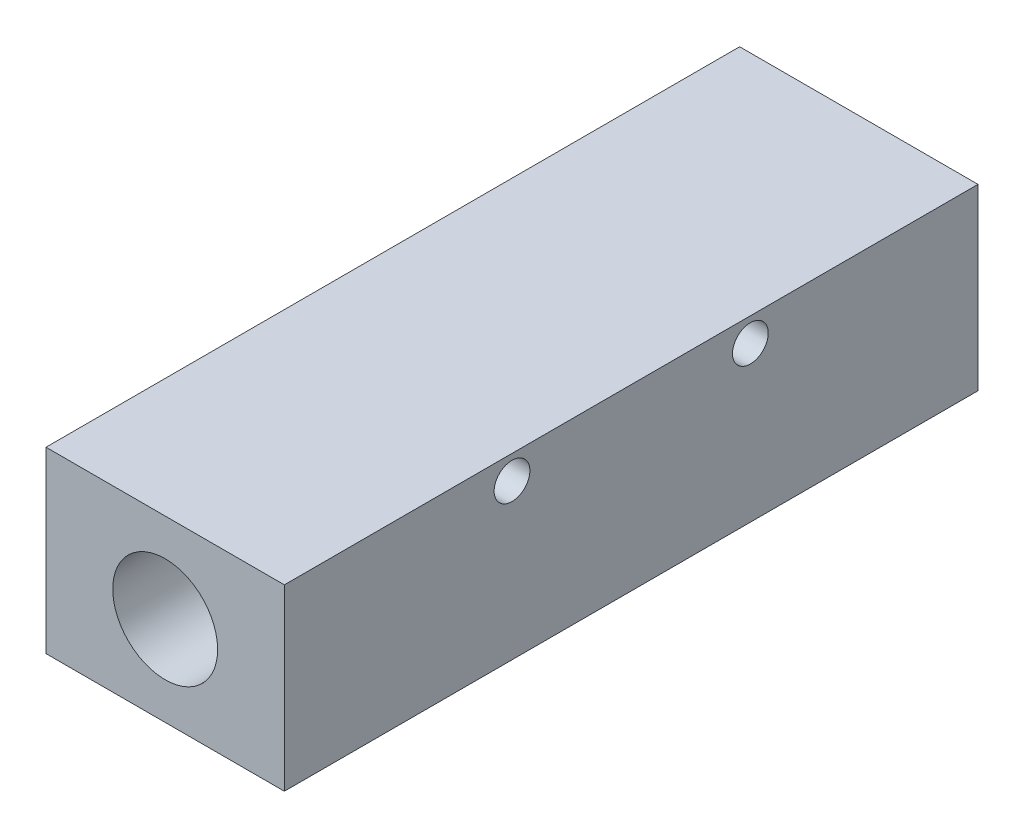
ISO-10303-21;
HEADER;
FILE_DESCRIPTION(('STEP AP214'),'2;1');
FILE_NAME('part.step','',(''),(''),'','','');
FILE_SCHEMA(('AUTOMOTIVE_DESIGN { 1 0 10303 214 1 1 1 1 }'));
ENDSEC;
DATA;
#1=APPLICATION_CONTEXT('core data for automotive mechanical design processes');
#2=APPLICATION_PROTOCOL_DEFINITION('international standard','automotive_design',2000,#1);
#3=PRODUCT_CONTEXT('',#1,'mechanical');
#4=PRODUCT('Part','Part','',(#3));
#5=PRODUCT_RELATED_PRODUCT_CATEGORY('part','',(#4));
#6=PRODUCT_DEFINITION_FORMATION('','',#4);
#7=PRODUCT_DEFINITION_CONTEXT('part definition',#1,'design');
#8=PRODUCT_DEFINITION('design','',#6,#7);
#9=PRODUCT_DEFINITION_SHAPE('','',#8);
#10=(LENGTH_UNIT() NAMED_UNIT(*) SI_UNIT(.MILLI.,.METRE.));
#11=(NAMED_UNIT(*) PLANE_ANGLE_UNIT() SI_UNIT($,.RADIAN.));
#12=(NAMED_UNIT(*) SI_UNIT($,.STERADIAN.) SOLID_ANGLE_UNIT());
#13=UNCERTAINTY_MEASURE_WITH_UNIT(LENGTH_MEASURE(1.E-05),#10,'distance_accuracy_value','');
#14=(GEOMETRIC_REPRESENTATION_CONTEXT(3) GLOBAL_UNCERTAINTY_ASSIGNED_CONTEXT((#13)) GLOBAL_UNIT_ASSIGNED_CONTEXT((#10,
#11,#12)) REPRESENTATION_CONTEXT('',''));
#15=CARTESIAN_POINT('',(0.,0.,0.));
#16=DIRECTION('',(0.,0.,1.));
#17=DIRECTION('',(1.,0.,0.));
#18=AXIS2_PLACEMENT_3D('',#15,#16,#17);
#19=CARTESIAN_POINT('',(0.,0.,0.));
#20=DIRECTION('',(0.,0.,-1.));
#21=DIRECTION('',(-1.,0.,0.));
#22=AXIS2_PLACEMENT_3D('',#19,#20,#21);
#23=CYLINDRICAL_SURFACE('',#22,3.);
#24=CARTESIAN_POINT('',(0.,0.,-13.5612048666386));
#25=DIRECTION('',(0.,0.,1.));
#26=DIRECTION('',(1.,0.,0.));
#27=AXIS2_PLACEMENT_3D('',#24,#25,#26);
#28=CIRCLE('',#27,3.);
#29=CARTESIAN_POINT('',(3.,0.,-13.5612048666386));
#30=VERTEX_POINT('',#29);
#31=EDGE_CURVE('E37',#30,#30,#28,.T.);
#32=ORIENTED_EDGE('',*,*,#31,.T.);
#33=EDGE_LOOP('',(#32));
#34=FACE_BOUND('',#33,.T.);
#35=CARTESIAN_POINT('',(0.,0.,-45.2));
#36=DIRECTION('',(0.,0.,-1.));
#37=DIRECTION('',(-1.,0.,0.));
#38=AXIS2_PLACEMENT_3D('',#35,#36,#37);
#39=CIRCLE('',#38,3.);
#40=CARTESIAN_POINT('',(-3.,0.,-45.2));
#41=VERTEX_POINT('',#40);
#42=EDGE_CURVE('E105',#41,#41,#39,.F.);
#43=ORIENTED_EDGE('',*,*,#42,.F.);
#44=EDGE_LOOP('',(#43));
#45=FACE_BOUND('',#44,.T.);
#46=ADVANCED_FACE('F33',(#34,#45),#23,.F.);
#47=CARTESIAN_POINT('',(-10.,-7.5,-58.2));
#48=DIRECTION('',(-1.,0.,0.));
#49=DIRECTION('',(0.,0.,1.));
#50=AXIS2_PLACEMENT_3D('',#47,#48,#49);
#51=PLANE('',#50);
#52=CARTESIAN_POINT('',(-10.,5.5,-39.1));
#53=DIRECTION('',(1.,0.,0.));
#54=DIRECTION('',(0.,0.,1.));
#55=AXIS2_PLACEMENT_3D('',#52,#53,#54);
#56=CIRCLE('',#55,1.5);
#57=CARTESIAN_POINT('',(-10.,5.5,-37.6));
#58=VERTEX_POINT('',#57);
#59=EDGE_CURVE('E126',#58,#58,#56,.T.);
#60=ORIENTED_EDGE('',*,*,#59,.T.);
#61=EDGE_LOOP('',(#60));
#62=FACE_BOUND('',#61,.T.);
#63=CARTESIAN_POINT('',(-10.,5.5,-19.1));
#64=DIRECTION('',(1.,0.,0.));
#65=DIRECTION('',(0.,0.,-1.));
#66=AXIS2_PLACEMENT_3D('',#63,#64,#65);
#67=CIRCLE('',#66,1.5);
#68=CARTESIAN_POINT('',(-10.,5.5,-20.6));
#69=VERTEX_POINT('',#68);
#70=EDGE_CURVE('E121',#69,#69,#67,.T.);
#71=ORIENTED_EDGE('',*,*,#70,.T.);
#72=EDGE_LOOP('',(#71));
#73=FACE_BOUND('',#72,.T.);
#74=DIRECTION('',(0.,-1.,0.));
#75=VECTOR('',#74,1.);
#76=CARTESIAN_POINT('',(-10.,-7.5,0.));
#77=LINE('',#76,#75);
#78=CARTESIAN_POINT('',(-10.,7.5,0.));
#79=VERTEX_POINT('',#78);
#80=CARTESIAN_POINT('',(-10.,-7.5,0.));
#81=VERTEX_POINT('',#80);
#82=EDGE_CURVE('E101',#79,#81,#77,.T.);
#83=ORIENTED_EDGE('',*,*,#82,.F.);
#84=DIRECTION('',(0.,0.,1.));
#85=VECTOR('',#84,1.);
#86=CARTESIAN_POINT('',(-10.,7.5,-58.2));
#87=LINE('',#86,#85);
#88=CARTESIAN_POINT('',(-10.,7.5,-58.2));
#89=VERTEX_POINT('',#88);
#90=EDGE_CURVE('E11',#89,#79,#87,.T.);
#91=ORIENTED_EDGE('',*,*,#90,.F.);
#92=DIRECTION('',(0.,-1.,0.));
#93=VECTOR('',#92,1.);
#94=CARTESIAN_POINT('',(-10.,-7.5,-58.2));
#95=LINE('',#94,#93);
#96=CARTESIAN_POINT('',(-10.,-7.5,-58.2));
#97=VERTEX_POINT('',#96);
#98=EDGE_CURVE('E94',#89,#97,#95,.T.);
#99=ORIENTED_EDGE('',*,*,#98,.T.);
#100=DIRECTION('',(0.,0.,1.));
#101=VECTOR('',#100,1.);
#102=CARTESIAN_POINT('',(-10.,-7.5,-58.2));
#103=LINE('',#102,#101);
#104=EDGE_CURVE('E77',#97,#81,#103,.T.);
#105=ORIENTED_EDGE('',*,*,#104,.T.);
#106=EDGE_LOOP('',(#83,#91,#99,#105));
#107=FACE_BOUND('',#106,.T.);
#108=ADVANCED_FACE('F35',(#62,#73,#107),#51,.T.);
#109=CARTESIAN_POINT('',(10.,7.5,-58.2));
#110=DIRECTION('',(0.,1.,0.));
#111=DIRECTION('',(-1.,0.,0.));
#112=AXIS2_PLACEMENT_3D('',#109,#110,#111);
#113=PLANE('',#112);
#114=DIRECTION('',(-1.,0.,0.));
#115=VECTOR('',#114,1.);
#116=CARTESIAN_POINT('',(10.,7.5,0.));
#117=LINE('',#116,#115);
#118=CARTESIAN_POINT('',(10.,7.5,0.));
#119=VERTEX_POINT('',#118);
#120=EDGE_CURVE('E96',#119,#79,#117,.T.);
#121=ORIENTED_EDGE('',*,*,#120,.F.);
#122=DIRECTION('',(0.,0.,1.));
#123=VECTOR('',#122,1.);
#124=CARTESIAN_POINT('',(10.,7.5,-58.2));
#125=LINE('',#124,#123);
#126=CARTESIAN_POINT('',(10.,7.5,-58.2));
#127=VERTEX_POINT('',#126);
#128=EDGE_CURVE('E43',#127,#119,#125,.T.);
#129=ORIENTED_EDGE('',*,*,#128,.F.);
#130=DIRECTION('',(-1.,0.,0.));
#131=VECTOR('',#130,1.);
#132=CARTESIAN_POINT('',(10.,7.5,-58.2));
#133=LINE('',#132,#131);
#134=EDGE_CURVE('E91',#127,#89,#133,.T.);
#135=ORIENTED_EDGE('',*,*,#134,.T.);
#136=ORIENTED_EDGE('',*,*,#90,.T.);
#137=EDGE_LOOP('',(#121,#129,#135,#136));
#138=FACE_BOUND('',#137,.T.);
#139=ADVANCED_FACE('F148',(#138),#113,.T.);
#140=CARTESIAN_POINT('',(10.,-7.5,-58.2));
#141=DIRECTION('',(1.,0.,0.));
#142=DIRECTION('',(0.,0.,-1.));
#143=AXIS2_PLACEMENT_3D('',#140,#141,#142);
#144=PLANE('',#143);
#145=CARTESIAN_POINT('',(10.,5.5,-39.1));
#146=DIRECTION('',(1.,0.,0.));
#147=DIRECTION('',(0.,0.,1.));
#148=AXIS2_PLACEMENT_3D('',#145,#146,#147);
#149=CIRCLE('',#148,1.5);
#150=CARTESIAN_POINT('',(10.,5.5,-37.6));
#151=VERTEX_POINT('',#150);
#152=EDGE_CURVE('E129',#151,#151,#149,.T.);
#153=ORIENTED_EDGE('',*,*,#152,.F.);
#154=EDGE_LOOP('',(#153));
#155=FACE_BOUND('',#154,.T.);
#156=CARTESIAN_POINT('',(10.,5.5,-19.1));
#157=DIRECTION('',(1.,0.,0.));
#158=DIRECTION('',(0.,0.,-1.));
#159=AXIS2_PLACEMENT_3D('',#156,#157,#158);
#160=CIRCLE('',#159,1.5);
#161=CARTESIAN_POINT('',(10.,5.5,-20.6));
#162=VERTEX_POINT('',#161);
#163=EDGE_CURVE('E123',#162,#162,#160,.T.);
#164=ORIENTED_EDGE('',*,*,#163,.F.);
#165=EDGE_LOOP('',(#164));
#166=FACE_BOUND('',#165,.T.);
#167=DIRECTION('',(0.,1.,0.));
#168=VECTOR('',#167,1.);
#169=CARTESIAN_POINT('',(10.,-7.5,0.));
#170=LINE('',#169,#168);
#171=CARTESIAN_POINT('',(10.,-7.5,0.));
#172=VERTEX_POINT('',#171);
#173=EDGE_CURVE('E85',#172,#119,#170,.T.);
#174=ORIENTED_EDGE('',*,*,#173,.F.);
#175=DIRECTION('',(0.,0.,1.));
#176=VECTOR('',#175,1.);
#177=CARTESIAN_POINT('',(10.,-7.5,-58.2));
#178=LINE('',#177,#176);
#179=CARTESIAN_POINT('',(10.,-7.5,-58.2));
#180=VERTEX_POINT('',#179);
#181=EDGE_CURVE('E80',#180,#172,#178,.T.);
#182=ORIENTED_EDGE('',*,*,#181,.F.);
#183=DIRECTION('',(0.,1.,0.));
#184=VECTOR('',#183,1.);
#185=CARTESIAN_POINT('',(10.,-7.5,-58.2));
#186=LINE('',#185,#184);
#187=EDGE_CURVE('E83',#180,#127,#186,.T.);
#188=ORIENTED_EDGE('',*,*,#187,.T.);
#189=ORIENTED_EDGE('',*,*,#128,.T.);
#190=EDGE_LOOP('',(#174,#182,#188,#189));
#191=FACE_BOUND('',#190,.T.);
#192=ADVANCED_FACE('F82',(#155,#166,#191),#144,.T.);
#193=CARTESIAN_POINT('',(10.,-7.5,-58.2));
#194=DIRECTION('',(0.,-1.,0.));
#195=DIRECTION('',(1.,0.,0.));
#196=AXIS2_PLACEMENT_3D('',#193,#194,#195);
#197=PLANE('',#196);
#198=DIRECTION('',(1.,0.,0.));
#199=VECTOR('',#198,1.);
#200=CARTESIAN_POINT('',(10.,-7.5,0.));
#201=LINE('',#200,#199);
#202=EDGE_CURVE('E104',#81,#172,#201,.T.);
#203=ORIENTED_EDGE('',*,*,#202,.F.);
#204=ORIENTED_EDGE('',*,*,#104,.F.);
#205=DIRECTION('',(1.,0.,0.));
#206=VECTOR('',#205,1.);
#207=CARTESIAN_POINT('',(10.,-7.5,-58.2));
#208=LINE('',#207,#206);
#209=EDGE_CURVE('E90',#97,#180,#208,.T.);
#210=ORIENTED_EDGE('',*,*,#209,.T.);
#211=ORIENTED_EDGE('',*,*,#181,.T.);
#212=EDGE_LOOP('',(#203,#204,#210,#211));
#213=FACE_BOUND('',#212,.T.);
#214=ADVANCED_FACE('F93',(#213),#197,.T.);
#215=CARTESIAN_POINT('',(0.,0.,-58.2));
#216=DIRECTION('',(0.,0.,1.));
#217=DIRECTION('',(1.,0.,0.));
#218=AXIS2_PLACEMENT_3D('',#215,#216,#217);
#219=PLANE('',#218);
#220=CARTESIAN_POINT('',(0.,0.,-58.2));
#221=DIRECTION('',(0.,0.,-1.));
#222=DIRECTION('',(-1.,0.,0.));
#223=AXIS2_PLACEMENT_3D('',#220,#221,#222);
#224=CIRCLE('',#223,6.75);
#225=CARTESIAN_POINT('',(-6.75,0.,-58.2));
#226=VERTEX_POINT('',#225);
#227=EDGE_CURVE('E116',#226,#226,#224,.T.);
#228=ORIENTED_EDGE('',*,*,#227,.F.);
#229=EDGE_LOOP('',(#228));
#230=FACE_BOUND('',#229,.T.);
#231=ORIENTED_EDGE('',*,*,#98,.F.);
#232=ORIENTED_EDGE('',*,*,#134,.F.);
#233=ORIENTED_EDGE('',*,*,#187,.F.);
#234=ORIENTED_EDGE('',*,*,#209,.F.);
#235=EDGE_LOOP('',(#231,#232,#233,#234));
#236=FACE_BOUND('',#235,.T.);
#237=ADVANCED_FACE('F89',(#230,#236),#219,.F.);
#238=CARTESIAN_POINT('',(0.,0.,0.));
#239=DIRECTION('',(0.,0.,1.));
#240=DIRECTION('',(1.,0.,0.));
#241=AXIS2_PLACEMENT_3D('',#238,#239,#240);
#242=PLANE('',#241);
#243=CARTESIAN_POINT('',(0.,0.,0.));
#244=DIRECTION('',(0.,0.,1.));
#245=DIRECTION('',(1.,0.,0.));
#246=AXIS2_PLACEMENT_3D('',#243,#244,#245);
#247=CIRCLE('',#246,4.39999999999999);
#248=CARTESIAN_POINT('',(4.39999999999999,0.,0.));
#249=VERTEX_POINT('',#248);
#250=EDGE_CURVE('E137',#249,#249,#247,.T.);
#251=ORIENTED_EDGE('',*,*,#250,.F.);
#252=EDGE_LOOP('',(#251));
#253=FACE_BOUND('',#252,.T.);
#254=ORIENTED_EDGE('',*,*,#82,.T.);
#255=ORIENTED_EDGE('',*,*,#202,.T.);
#256=ORIENTED_EDGE('',*,*,#173,.T.);
#257=ORIENTED_EDGE('',*,*,#120,.T.);
#258=EDGE_LOOP('',(#254,#255,#256,#257));
#259=FACE_BOUND('',#258,.T.);
#260=ADVANCED_FACE('F143',(#253,#259),#242,.T.);
#261=CARTESIAN_POINT('',(0.,0.,-45.2));
#262=DIRECTION('',(0.,0.,-1.));
#263=DIRECTION('',(-1.,0.,0.));
#264=AXIS2_PLACEMENT_3D('',#261,#262,#263);
#265=PLANE('',#264);
#266=CARTESIAN_POINT('',(0.,0.,-45.2));
#267=DIRECTION('',(0.,0.,-1.));
#268=DIRECTION('',(-1.,0.,0.));
#269=AXIS2_PLACEMENT_3D('',#266,#267,#268);
#270=CIRCLE('',#269,6.75);
#271=CARTESIAN_POINT('',(-6.75,0.,-45.2));
#272=VERTEX_POINT('',#271);
#273=EDGE_CURVE('E112',#272,#272,#270,.T.);
#274=ORIENTED_EDGE('',*,*,#273,.T.);
#275=EDGE_LOOP('',(#274));
#276=FACE_BOUND('',#275,.T.);
#277=ORIENTED_EDGE('',*,*,#42,.T.);
#278=EDGE_LOOP('',(#277));
#279=FACE_BOUND('',#278,.T.);
#280=ADVANCED_FACE('F146',(#276,#279),#265,.T.);
#281=CARTESIAN_POINT('',(0.,0.,-45.2));
#282=DIRECTION('',(0.,0.,-1.));
#283=DIRECTION('',(-1.,0.,0.));
#284=AXIS2_PLACEMENT_3D('',#281,#282,#283);
#285=CYLINDRICAL_SURFACE('',#284,6.75);
#286=CARTESIAN_POINT('',(-6.75,0.,-45.2));
#287=CARTESIAN_POINT('',(-6.75,0.,-45.3354166666667));
#288=CARTESIAN_POINT('',(-6.75,0.,-45.4708333333333));
#289=CARTESIAN_POINT('',(-6.75,0.,-45.7416666666667));
#290=CARTESIAN_POINT('',(-6.75,0.,-45.8770833333333));
#291=CARTESIAN_POINT('',(-6.75,0.,-46.1479166666667));
#292=CARTESIAN_POINT('',(-6.75,0.,-46.2833333333333));
#293=CARTESIAN_POINT('',(-6.75,0.,-46.5541666666667));
#294=CARTESIAN_POINT('',(-6.75,0.,-46.6895833333333));
#295=CARTESIAN_POINT('',(-6.75,0.,-46.9604166666667));
#296=CARTESIAN_POINT('',(-6.75,0.,-47.0958333333333));
#297=CARTESIAN_POINT('',(-6.75,0.,-47.3666666666667));
#298=CARTESIAN_POINT('',(-6.75,0.,-47.5020833333333));
#299=CARTESIAN_POINT('',(-6.75,0.,-47.7729166666667));
#300=CARTESIAN_POINT('',(-6.75,0.,-47.9083333333333));
#301=CARTESIAN_POINT('',(-6.75,0.,-48.1791666666667));
#302=CARTESIAN_POINT('',(-6.75,0.,-48.3145833333333));
#303=CARTESIAN_POINT('',(-6.75,0.,-48.5854166666667));
#304=CARTESIAN_POINT('',(-6.75,0.,-48.7208333333333));
#305=CARTESIAN_POINT('',(-6.75,0.,-48.9916666666667));
#306=CARTESIAN_POINT('',(-6.75,0.,-49.1270833333333));
#307=CARTESIAN_POINT('',(-6.75,0.,-49.3979166666667));
#308=CARTESIAN_POINT('',(-6.75,0.,-49.5333333333333));
#309=CARTESIAN_POINT('',(-6.75,0.,-49.8041666666667));
#310=CARTESIAN_POINT('',(-6.75,0.,-49.9395833333333));
#311=CARTESIAN_POINT('',(-6.75,0.,-50.2104166666667));
#312=CARTESIAN_POINT('',(-6.75,0.,-50.3458333333333));
#313=CARTESIAN_POINT('',(-6.75,0.,-50.6166666666667));
#314=CARTESIAN_POINT('',(-6.75,0.,-50.7520833333333));
#315=CARTESIAN_POINT('',(-6.75,0.,-51.0229166666667));
#316=CARTESIAN_POINT('',(-6.75,0.,-51.1583333333333));
#317=CARTESIAN_POINT('',(-6.75,0.,-51.4291666666667));
#318=CARTESIAN_POINT('',(-6.75,0.,-51.5645833333333));
#319=CARTESIAN_POINT('',(-6.75,0.,-51.8354166666667));
#320=CARTESIAN_POINT('',(-6.75,0.,-51.9708333333333));
#321=CARTESIAN_POINT('',(-6.75,0.,-52.2416666666667));
#322=CARTESIAN_POINT('',(-6.75,0.,-52.3770833333333));
#323=CARTESIAN_POINT('',(-6.75,0.,-52.6479166666667));
#324=CARTESIAN_POINT('',(-6.75,0.,-52.7833333333333));
#325=CARTESIAN_POINT('',(-6.75,0.,-53.0541666666667));
#326=CARTESIAN_POINT('',(-6.75,0.,-53.1895833333333));
#327=CARTESIAN_POINT('',(-6.75,0.,-53.4604166666667));
#328=CARTESIAN_POINT('',(-6.75,0.,-53.5958333333333));
#329=CARTESIAN_POINT('',(-6.75,0.,-53.8666666666667));
#330=CARTESIAN_POINT('',(-6.75,0.,-54.0020833333333));
#331=CARTESIAN_POINT('',(-6.75,0.,-54.2729166666667));
#332=CARTESIAN_POINT('',(-6.75,0.,-54.4083333333333));
#333=CARTESIAN_POINT('',(-6.75,0.,-54.6791666666667));
#334=CARTESIAN_POINT('',(-6.75,0.,-54.8145833333333));
#335=CARTESIAN_POINT('',(-6.75,0.,-55.0854166666667));
#336=CARTESIAN_POINT('',(-6.75,0.,-55.2208333333333));
#337=CARTESIAN_POINT('',(-6.75,0.,-55.4916666666667));
#338=CARTESIAN_POINT('',(-6.75,0.,-55.6270833333333));
#339=CARTESIAN_POINT('',(-6.75,0.,-55.8979166666667));
#340=CARTESIAN_POINT('',(-6.75,0.,-56.0333333333333));
#341=CARTESIAN_POINT('',(-6.75,0.,-56.3041666666667));
#342=CARTESIAN_POINT('',(-6.75,0.,-56.4395833333333));
#343=CARTESIAN_POINT('',(-6.75,0.,-56.7104166666667));
#344=CARTESIAN_POINT('',(-6.75,0.,-56.8458333333333));
#345=CARTESIAN_POINT('',(-6.75,0.,-57.1166666666667));
#346=CARTESIAN_POINT('',(-6.75,0.,-57.2520833333333));
#347=CARTESIAN_POINT('',(-6.75,0.,-57.5229166666667));
#348=CARTESIAN_POINT('',(-6.75,0.,-57.6583333333333));
#349=CARTESIAN_POINT('',(-6.75,0.,-57.9291666666667));
#350=CARTESIAN_POINT('',(-6.75,0.,-58.0645833333333));
#351=CARTESIAN_POINT('',(-6.75,0.,-58.2));
#352=B_SPLINE_CURVE_WITH_KNOTS('',3,(#286,#287,#288,#289,#290,#291,#292,#293,#294,#295,#296,
#297,#298,#299,#300,#301,#302,#303,#304,#305,#306,#307,#308,#309,#310,#311,#312,#313,#314,#315,
#316,#317,#318,#319,#320,#321,#322,#323,#324,#325,#326,#327,#328,#329,#330,#331,#332,#333,#334,
#335,#336,#337,#338,#339,#340,#341,#342,#343,#344,#345,#346,#347,#348,#349,#350,#351),
.UNSPECIFIED.,.F.,.F.,(4,2,2,2,2,2,2,2,2,2,2,2,2,2,2,2,2,2,2,2,2,2,2,2,2,2,2,2,2,2,2,2,4),(0.,
0.406249999999997,0.812499999999994,1.21875,1.62499999999999,2.03125,2.4375,2.84374999999999,
3.25,3.65624999999999,4.0625,4.46874999999999,4.875,5.28124999999999,5.6875,6.09374999999999,
6.49999999999999,6.90625,7.31249999999999,7.71875,8.12499999999999,8.53124999999999,
8.93749999999999,9.34374999999999,9.74999999999999,10.15625,10.5625,10.96875,11.375,11.78125,
12.1875,12.59375,13.),.UNSPECIFIED.);
#353=EDGE_CURVE('BSEAM170',#272,#226,#352,.T.);
#354=ORIENTED_EDGE('',*,*,#273,.F.);
#355=ORIENTED_EDGE('',*,*,#227,.T.);
#356=ORIENTED_EDGE('',*,*,#353,.T.);
#357=ORIENTED_EDGE('',*,*,#353,.F.);
#358=EDGE_LOOP('',(#354,#356,#355,#357));
#359=FACE_BOUND('',#358,.T.);
#360=ADVANCED_FACE('F170',(#359),#285,.F.);
#361=CARTESIAN_POINT('',(-10.,5.5,-19.1));
#362=DIRECTION('',(1.,0.,0.));
#363=DIRECTION('',(0.,0.,-1.));
#364=AXIS2_PLACEMENT_3D('',#361,#362,#363);
#365=CYLINDRICAL_SURFACE('',#364,1.5);
#366=ORIENTED_EDGE('',*,*,#70,.F.);
#367=EDGE_LOOP('',(#366));
#368=FACE_BOUND('',#367,.T.);
#369=ORIENTED_EDGE('',*,*,#163,.T.);
#370=EDGE_LOOP('',(#369));
#371=FACE_BOUND('',#370,.T.);
#372=ADVANCED_FACE('F181',(#368,#371),#365,.F.);
#373=CARTESIAN_POINT('',(-10.,5.5,-39.1));
#374=DIRECTION('',(1.,0.,0.));
#375=DIRECTION('',(0.,0.,-1.));
#376=AXIS2_PLACEMENT_3D('',#373,#374,#375);
#377=CYLINDRICAL_SURFACE('',#376,1.5);
#378=ORIENTED_EDGE('',*,*,#59,.F.);
#379=EDGE_LOOP('',(#378));
#380=FACE_BOUND('',#379,.T.);
#381=ORIENTED_EDGE('',*,*,#152,.T.);
#382=EDGE_LOOP('',(#381));
#383=FACE_BOUND('',#382,.T.);
#384=ADVANCED_FACE('F187',(#380,#383),#377,.F.);
#385=CARTESIAN_POINT('',(0.,0.,-12.72));
#386=DIRECTION('',(0.,0.,1.));
#387=DIRECTION('',(1.,0.,0.));
#388=AXIS2_PLACEMENT_3D('',#385,#386,#387);
#389=CONICAL_SURFACE('',#388,4.4,1.02974425867665);
#390=CARTESIAN_POINT('',(0.,0.,-12.72));
#391=DIRECTION('',(0.,0.,1.));
#392=DIRECTION('',(1.,0.,0.));
#393=AXIS2_PLACEMENT_3D('',#390,#391,#392);
#394=CIRCLE('',#393,4.4);
#395=CARTESIAN_POINT('',(4.4,0.,-12.72));
#396=VERTEX_POINT('',#395);
#397=EDGE_CURVE('E134',#396,#396,#394,.T.);
#398=ORIENTED_EDGE('',*,*,#397,.T.);
#399=EDGE_LOOP('',(#398));
#400=FACE_BOUND('',#399,.T.);
#401=ORIENTED_EDGE('',*,*,#31,.F.);
#402=EDGE_LOOP('',(#401));
#403=FACE_BOUND('',#402,.T.);
#404=ADVANCED_FACE('F195',(#400,#403),#389,.F.);
#405=CARTESIAN_POINT('',(0.,0.,0.));
#406=DIRECTION('',(0.,0.,1.));
#407=DIRECTION('',(1.,0.,0.));
#408=AXIS2_PLACEMENT_3D('',#405,#406,#407);
#409=CYLINDRICAL_SURFACE('',#408,4.39999999999999);
#410=ORIENTED_EDGE('',*,*,#397,.F.);
#411=EDGE_LOOP('',(#410));
#412=FACE_BOUND('',#411,.T.);
#413=ORIENTED_EDGE('',*,*,#250,.T.);
#414=EDGE_LOOP('',(#413));
#415=FACE_BOUND('',#414,.T.);
#416=ADVANCED_FACE('F141',(#412,#415),#409,.F.);
#417=CLOSED_SHELL('',(#46,#108,#139,#192,#214,#237,#260,#280,#360,#372,#384,#404,#416));
#418=MANIFOLD_SOLID_BREP('B2',#417);
#419=ADVANCED_BREP_SHAPE_REPRESENTATION('',(#18,#418),#14);
#420=SHAPE_DEFINITION_REPRESENTATION(#9,#419);
ENDSEC;
END-ISO-10303-21;
